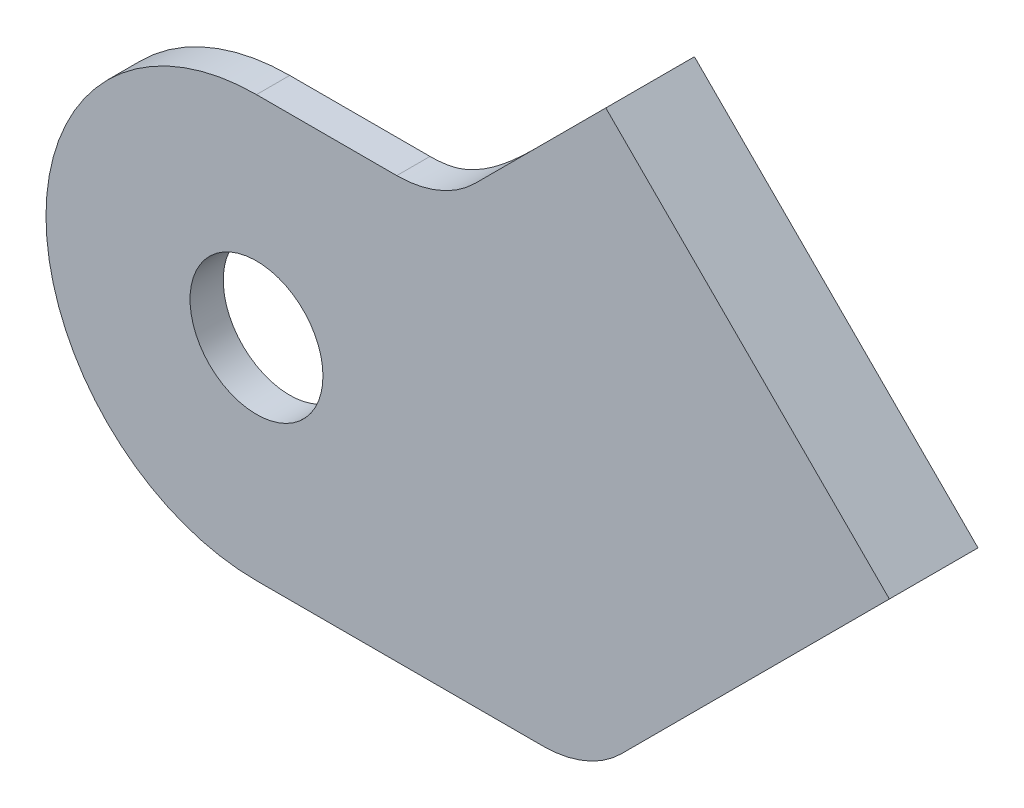
ISO-10303-21;
HEADER;
FILE_DESCRIPTION(('STEP AP214'),'2;1');
FILE_NAME('part.step','',(''),(''),'','','');
FILE_SCHEMA(('AUTOMOTIVE_DESIGN { 1 0 10303 214 1 1 1 1 }'));
ENDSEC;
DATA;
#1=APPLICATION_CONTEXT('core data for automotive mechanical design processes');
#2=APPLICATION_PROTOCOL_DEFINITION('international standard','automotive_design',2000,#1);
#3=PRODUCT_CONTEXT('',#1,'mechanical');
#4=PRODUCT('Part','Part','',(#3));
#5=PRODUCT_RELATED_PRODUCT_CATEGORY('part','',(#4));
#6=PRODUCT_DEFINITION_FORMATION('','',#4);
#7=PRODUCT_DEFINITION_CONTEXT('part definition',#1,'design');
#8=PRODUCT_DEFINITION('design','',#6,#7);
#9=PRODUCT_DEFINITION_SHAPE('','',#8);
#10=(LENGTH_UNIT() NAMED_UNIT(*) SI_UNIT(.MILLI.,.METRE.));
#11=(NAMED_UNIT(*) PLANE_ANGLE_UNIT() SI_UNIT($,.RADIAN.));
#12=(NAMED_UNIT(*) SI_UNIT($,.STERADIAN.) SOLID_ANGLE_UNIT());
#13=UNCERTAINTY_MEASURE_WITH_UNIT(LENGTH_MEASURE(1.E-05),#10,'distance_accuracy_value','');
#14=(GEOMETRIC_REPRESENTATION_CONTEXT(3) GLOBAL_UNCERTAINTY_ASSIGNED_CONTEXT((#13)) GLOBAL_UNIT_ASSIGNED_CONTEXT((#10,
#11,#12)) REPRESENTATION_CONTEXT('',''));
#15=CARTESIAN_POINT('',(0.,0.,0.));
#16=DIRECTION('',(0.,0.,1.));
#17=DIRECTION('',(1.,0.,0.));
#18=AXIS2_PLACEMENT_3D('',#15,#16,#17);
#19=CARTESIAN_POINT('',(0.,0.,0.));
#20=DIRECTION('',(0.,0.,1.));
#21=DIRECTION('',(1.,0.,0.));
#22=AXIS2_PLACEMENT_3D('',#19,#20,#21);
#23=PLANE('',#22);
#24=CARTESIAN_POINT('',(0.,0.,0.));
#25=DIRECTION('',(0.,0.,1.));
#26=DIRECTION('',(1.,0.,0.));
#27=AXIS2_PLACEMENT_3D('',#24,#25,#26);
#28=CIRCLE('',#27,6.);
#29=CARTESIAN_POINT('',(6.,0.,0.));
#30=VERTEX_POINT('',#29);
#31=EDGE_CURVE('E139',#30,#30,#28,.T.);
#32=ORIENTED_EDGE('',*,*,#31,.T.);
#33=EDGE_LOOP('',(#32));
#34=FACE_BOUND('',#33,.T.);
#35=CARTESIAN_POINT('',(12.663333418362,29.,0.));
#36=DIRECTION('',(0.,0.,1.));
#37=DIRECTION('',(1.,0.,0.));
#38=AXIS2_PLACEMENT_3D('',#35,#36,#37);
#39=CIRCLE('',#38,10.);
#40=CARTESIAN_POINT('',(12.663333418362,19.,0.));
#41=VERTEX_POINT('',#40);
#42=CARTESIAN_POINT('',(14.4062480565193,19.1530589234983,0.));
#43=VERTEX_POINT('',#42);
#44=EDGE_CURVE('E239',#41,#43,#39,.T.);
#45=ORIENTED_EDGE('',*,*,#44,.T.);
#46=DIRECTION('',(0.707106781186547,-0.707106781186548,0.));
#47=VECTOR('',#46,1.);
#48=CARTESIAN_POINT('',(16.7796534900088,16.7796534900088,0.));
#49=LINE('',#48,#47);
#50=CARTESIAN_POINT('',(41.279653490009,-7.72034650999148,0.));
#51=VERTEX_POINT('',#50);
#52=EDGE_CURVE('E179',#43,#51,#49,.T.);
#53=ORIENTED_EDGE('',*,*,#52,.T.);
#54=DIRECTION('',(0.707106781186534,0.707106781186562,0.));
#55=VECTOR('',#54,1.);
#56=CARTESIAN_POINT('',(30.0000000000005,-19.0000000000005,0.));
#57=LINE('',#56,#55);
#58=CARTESIAN_POINT('',(32.9289321881351,-16.0710678118657,0.));
#59=VERTEX_POINT('',#58);
#60=EDGE_CURVE('E118',#59,#51,#57,.T.);
#61=ORIENTED_EDGE('',*,*,#60,.F.);
#62=CARTESIAN_POINT('',(25.8578643762695,-9.00000000000041,0.));
#63=DIRECTION('',(0.,0.,1.));
#64=DIRECTION('',(1.,0.,0.));
#65=AXIS2_PLACEMENT_3D('',#62,#63,#64);
#66=CIRCLE('',#65,10.);
#67=CARTESIAN_POINT('',(25.8578643762693,-19.0000000000004,0.));
#68=VERTEX_POINT('',#67);
#69=EDGE_CURVE('E236',#59,#68,#66,.F.);
#70=ORIENTED_EDGE('',*,*,#69,.T.);
#71=DIRECTION('',(1.,0.,0.));
#72=VECTOR('',#71,1.);
#73=CARTESIAN_POINT('',(0.,-19.,0.));
#74=LINE('',#73,#72);
#75=CARTESIAN_POINT('',(0.,-19.,0.));
#76=VERTEX_POINT('',#75);
#77=EDGE_CURVE('E168',#76,#68,#74,.T.);
#78=ORIENTED_EDGE('',*,*,#77,.F.);
#79=CARTESIAN_POINT('',(0.,0.,0.));
#80=DIRECTION('',(0.,0.,1.));
#81=DIRECTION('',(1.,0.,0.));
#82=AXIS2_PLACEMENT_3D('',#79,#80,#81);
#83=CIRCLE('',#82,19.);
#84=CARTESIAN_POINT('',(0.,19.,0.));
#85=VERTEX_POINT('',#84);
#86=EDGE_CURVE('E149',#85,#76,#83,.T.);
#87=ORIENTED_EDGE('',*,*,#86,.F.);
#88=DIRECTION('',(-1.,0.,0.));
#89=VECTOR('',#88,1.);
#90=CARTESIAN_POINT('',(16.8054690420928,19.,0.));
#91=LINE('',#90,#89);
#92=EDGE_CURVE('E155',#41,#85,#91,.T.);
#93=ORIENTED_EDGE('',*,*,#92,.F.);
#94=EDGE_LOOP('',(#45,#53,#61,#70,#78,#87,#93));
#95=FACE_BOUND('',#94,.T.);
#96=ADVANCED_FACE('F35',(#34,#95),#23,.F.);
#97=CARTESIAN_POINT('',(0.,0.,3.));
#98=DIRECTION('',(0.,0.,1.));
#99=DIRECTION('',(1.,0.,0.));
#100=AXIS2_PLACEMENT_3D('',#97,#98,#99);
#101=PLANE('',#100);
#102=CARTESIAN_POINT('',(0.,0.,3.));
#103=DIRECTION('',(0.,0.,1.));
#104=DIRECTION('',(1.,0.,0.));
#105=AXIS2_PLACEMENT_3D('',#102,#103,#104);
#106=CIRCLE('',#105,6.);
#107=CARTESIAN_POINT('',(6.,0.,3.));
#108=VERTEX_POINT('',#107);
#109=EDGE_CURVE('E138',#108,#108,#106,.T.);
#110=ORIENTED_EDGE('',*,*,#109,.F.);
#111=EDGE_LOOP('',(#110));
#112=FACE_BOUND('',#111,.T.);
#113=DIRECTION('',(0.707106781186548,-0.707106781186547,0.));
#114=VECTOR('',#113,1.);
#115=CARTESIAN_POINT('',(31.5330339697045,33.727564927611,3.));
#116=LINE('',#115,#114);
#117=CARTESIAN_POINT('',(31.5330339697045,33.727564927611,3.));
#118=VERTEX_POINT('',#117);
#119=CARTESIAN_POINT('',(57.1302994486582,8.13029944865731,3.));
#120=VERTEX_POINT('',#119);
#121=EDGE_CURVE('E142',#118,#120,#116,.T.);
#122=ORIENTED_EDGE('',*,*,#121,.F.);
#123=DIRECTION('',(-0.707106781186559,-0.707106781186536,0.));
#124=VECTOR('',#123,1.);
#125=CARTESIAN_POINT('',(38.60410178157,40.7986327394764,3.));
#126=LINE('',#125,#124);
#127=CARTESIAN_POINT('',(19.7344012302274,21.9289321881344,3.));
#128=VERTEX_POINT('',#127);
#129=EDGE_CURVE('E161',#118,#128,#126,.T.);
#130=ORIENTED_EDGE('',*,*,#129,.T.);
#131=CARTESIAN_POINT('',(12.663333418362,29.,3.));
#132=DIRECTION('',(0.,0.,1.));
#133=DIRECTION('',(1.,0.,0.));
#134=AXIS2_PLACEMENT_3D('',#131,#132,#133);
#135=CIRCLE('',#134,10.);
#136=CARTESIAN_POINT('',(12.663333418362,19.,3.));
#137=VERTEX_POINT('',#136);
#138=EDGE_CURVE('E177',#128,#137,#135,.F.);
#139=ORIENTED_EDGE('',*,*,#138,.T.);
#140=DIRECTION('',(-1.,0.,0.));
#141=VECTOR('',#140,1.);
#142=CARTESIAN_POINT('',(16.8054690420928,19.,3.));
#143=LINE('',#142,#141);
#144=CARTESIAN_POINT('',(0.,19.,3.));
#145=VERTEX_POINT('',#144);
#146=EDGE_CURVE('E163',#137,#145,#143,.T.);
#147=ORIENTED_EDGE('',*,*,#146,.T.);
#148=CARTESIAN_POINT('',(0.,0.,3.));
#149=DIRECTION('',(0.,0.,1.));
#150=DIRECTION('',(1.,0.,0.));
#151=AXIS2_PLACEMENT_3D('',#148,#149,#150);
#152=CIRCLE('',#151,19.);
#153=CARTESIAN_POINT('',(0.,-19.,3.));
#154=VERTEX_POINT('',#153);
#155=EDGE_CURVE('E151',#145,#154,#152,.T.);
#156=ORIENTED_EDGE('',*,*,#155,.T.);
#157=DIRECTION('',(1.,0.,0.));
#158=VECTOR('',#157,1.);
#159=CARTESIAN_POINT('',(0.,-19.,3.));
#160=LINE('',#159,#158);
#161=CARTESIAN_POINT('',(25.8578643762693,-19.0000000000004,3.));
#162=VERTEX_POINT('',#161);
#163=EDGE_CURVE('E154',#154,#162,#160,.T.);
#164=ORIENTED_EDGE('',*,*,#163,.T.);
#165=CARTESIAN_POINT('',(25.8578643762695,-9.00000000000041,3.));
#166=DIRECTION('',(0.,0.,1.));
#167=DIRECTION('',(1.,0.,0.));
#168=AXIS2_PLACEMENT_3D('',#165,#166,#167);
#169=CIRCLE('',#168,10.);
#170=CARTESIAN_POINT('',(32.9289321881351,-16.0710678118657,3.));
#171=VERTEX_POINT('',#170);
#172=EDGE_CURVE('E237',#162,#171,#169,.T.);
#173=ORIENTED_EDGE('',*,*,#172,.T.);
#174=DIRECTION('',(0.707106781186534,0.707106781186562,0.));
#175=VECTOR('',#174,1.);
#176=CARTESIAN_POINT('',(30.0000000000005,-19.0000000000005,3.));
#177=LINE('',#176,#175);
#178=EDGE_CURVE('E158',#171,#120,#177,.T.);
#179=ORIENTED_EDGE('',*,*,#178,.T.);
#180=EDGE_LOOP('',(#122,#130,#139,#147,#156,#164,#173,#179));
#181=FACE_BOUND('',#180,.T.);
#182=ADVANCED_FACE('F204',(#112,#181),#101,.T.);
#183=CARTESIAN_POINT('',(0.,0.,3.));
#184=DIRECTION('',(0.,0.,-1.));
#185=DIRECTION('',(-1.,0.,0.));
#186=AXIS2_PLACEMENT_3D('',#183,#184,#185);
#187=CYLINDRICAL_SURFACE('',#186,19.);
#188=ORIENTED_EDGE('',*,*,#86,.T.);
#189=DIRECTION('',(0.,0.,-1.));
#190=VECTOR('',#189,1.);
#191=CARTESIAN_POINT('',(0.,-19.,3.));
#192=LINE('',#191,#190);
#193=EDGE_CURVE('E233',#154,#76,#192,.T.);
#194=ORIENTED_EDGE('',*,*,#193,.F.);
#195=ORIENTED_EDGE('',*,*,#155,.F.);
#196=DIRECTION('',(0.,0.,-1.));
#197=VECTOR('',#196,1.);
#198=CARTESIAN_POINT('',(0.,19.,3.));
#199=LINE('',#198,#197);
#200=EDGE_CURVE('E165',#145,#85,#199,.T.);
#201=ORIENTED_EDGE('',*,*,#200,.T.);
#202=EDGE_LOOP('',(#188,#194,#195,#201));
#203=FACE_BOUND('',#202,.T.);
#204=ADVANCED_FACE('F191',(#203),#187,.T.);
#205=CARTESIAN_POINT('',(0.,-19.,3.));
#206=DIRECTION('',(0.,1.,0.));
#207=DIRECTION('',(-1.,0.,0.));
#208=AXIS2_PLACEMENT_3D('',#205,#206,#207);
#209=PLANE('',#208);
#210=ORIENTED_EDGE('',*,*,#77,.T.);
#211=DIRECTION('',(0.,0.,-1.));
#212=VECTOR('',#211,1.);
#213=CARTESIAN_POINT('',(25.8578643762693,-19.0000000000004,3.));
#214=LINE('',#213,#212);
#215=EDGE_CURVE('E231',#68,#162,#214,.F.);
#216=ORIENTED_EDGE('',*,*,#215,.T.);
#217=ORIENTED_EDGE('',*,*,#163,.F.);
#218=ORIENTED_EDGE('',*,*,#193,.T.);
#219=EDGE_LOOP('',(#210,#216,#217,#218));
#220=FACE_BOUND('',#219,.T.);
#221=ADVANCED_FACE('F222',(#220),#209,.F.);
#222=CARTESIAN_POINT('',(30.0000000000005,-19.0000000000005,3.));
#223=DIRECTION('',(-0.707106781186561,0.707106781186533,0.));
#224=DIRECTION('',(-0.707106781186534,-0.707106781186562,0.));
#225=AXIS2_PLACEMENT_3D('',#222,#223,#224);
#226=PLANE('',#225);
#227=ORIENTED_EDGE('',*,*,#60,.T.);
#228=CARTESIAN_POINT('',(41.279653490009,-7.72034650999149,-8.));
#229=DIRECTION('',(-0.707106781186561,0.707106781186533,0.));
#230=DIRECTION('',(-0.707106781186534,-0.707106781186562,0.));
#231=AXIS2_PLACEMENT_3D('',#228,#229,#230);
#232=CIRCLE('',#231,8.);
#233=CARTESIAN_POINT('',(46.52369773086,-2.47630226914089,-5.));
#234=VERTEX_POINT('',#233);
#235=EDGE_CURVE('E11',#51,#234,#232,.T.);
#236=ORIENTED_EDGE('',*,*,#235,.T.);
#237=DIRECTION('',(-0.707106781186548,-0.707106781186547,0.));
#238=VECTOR('',#237,1.);
#239=CARTESIAN_POINT('',(46.52369773086,-2.47630226914089,-5.));
#240=LINE('',#239,#238);
#241=CARTESIAN_POINT('',(57.1302994486582,8.13029944865731,-5.));
#242=VERTEX_POINT('',#241);
#243=EDGE_CURVE('E115',#242,#234,#240,.T.);
#244=ORIENTED_EDGE('',*,*,#243,.F.);
#245=DIRECTION('',(0.,0.,1.));
#246=VECTOR('',#245,1.);
#247=CARTESIAN_POINT('',(57.1302994486582,8.13029944865731,0.));
#248=LINE('',#247,#246);
#249=EDGE_CURVE('E147',#242,#120,#248,.T.);
#250=ORIENTED_EDGE('',*,*,#249,.T.);
#251=ORIENTED_EDGE('',*,*,#178,.F.);
#252=DIRECTION('',(0.,0.,-1.));
#253=VECTOR('',#252,1.);
#254=CARTESIAN_POINT('',(32.9289321881351,-16.0710678118657,3.));
#255=LINE('',#254,#253);
#256=EDGE_CURVE('E241',#171,#59,#255,.T.);
#257=ORIENTED_EDGE('',*,*,#256,.T.);
#258=EDGE_LOOP('',(#227,#236,#244,#250,#251,#257));
#259=FACE_BOUND('',#258,.T.);
#260=ADVANCED_FACE('F113',(#259),#226,.F.);
#261=CARTESIAN_POINT('',(38.60410178157,40.7986327394764,3.));
#262=DIRECTION('',(0.707106781186536,-0.707106781186559,0.));
#263=DIRECTION('',(0.707106781186559,0.707106781186536,0.));
#264=AXIS2_PLACEMENT_3D('',#261,#262,#263);
#265=PLANE('',#264);
#266=ORIENTED_EDGE('',*,*,#129,.F.);
#267=DIRECTION('',(0.,0.,1.));
#268=VECTOR('',#267,1.);
#269=CARTESIAN_POINT('',(31.5330339697045,33.727564927611,0.));
#270=LINE('',#269,#268);
#271=CARTESIAN_POINT('',(31.5330339697045,33.7275649276112,-5.));
#272=VERTEX_POINT('',#271);
#273=EDGE_CURVE('E146',#272,#118,#270,.T.);
#274=ORIENTED_EDGE('',*,*,#273,.F.);
#275=DIRECTION('',(0.707106781186548,0.707106781186547,0.));
#276=VECTOR('',#275,1.);
#277=CARTESIAN_POINT('',(31.5330339697045,33.7275649276112,-5.));
#278=LINE('',#277,#276);
#279=CARTESIAN_POINT('',(20.9264322519062,23.1209632098129,-5.));
#280=VERTEX_POINT('',#279);
#281=EDGE_CURVE('E133',#280,#272,#278,.T.);
#282=ORIENTED_EDGE('',*,*,#281,.F.);
#283=CARTESIAN_POINT('',(15.6823880110552,17.8769189689624,-8.));
#284=DIRECTION('',(0.707106781186536,-0.707106781186559,0.));
#285=DIRECTION('',(0.707106781186559,0.707106781186536,0.));
#286=AXIS2_PLACEMENT_3D('',#283,#284,#285);
#287=CIRCLE('',#286,8.);
#288=CARTESIAN_POINT('',(19.7344012302274,21.9289321881344,-2.41767273054429));
#289=VERTEX_POINT('',#288);
#290=EDGE_CURVE('E132',#280,#289,#287,.T.);
#291=ORIENTED_EDGE('',*,*,#290,.T.);
#292=DIRECTION('',(0.,0.,-1.));
#293=VECTOR('',#292,1.);
#294=CARTESIAN_POINT('',(19.7344012302274,21.9289321881344,3.));
#295=LINE('',#294,#293);
#296=EDGE_CURVE('E51',#289,#128,#295,.F.);
#297=ORIENTED_EDGE('',*,*,#296,.T.);
#298=EDGE_LOOP('',(#266,#274,#282,#291,#297));
#299=FACE_BOUND('',#298,.T.);
#300=ADVANCED_FACE('F216',(#299),#265,.F.);
#301=CARTESIAN_POINT('',(16.8054690420928,19.,3.));
#302=DIRECTION('',(0.,-1.,0.));
#303=DIRECTION('',(0.,0.,-1.));
#304=AXIS2_PLACEMENT_3D('',#301,#302,#303);
#305=PLANE('',#304);
#306=ORIENTED_EDGE('',*,*,#146,.F.);
#307=DIRECTION('',(0.,0.,-1.));
#308=VECTOR('',#307,1.);
#309=CARTESIAN_POINT('',(12.663333418362,19.,0.));
#310=LINE('',#309,#308);
#311=EDGE_CURVE('E252',#137,#41,#310,.T.);
#312=ORIENTED_EDGE('',*,*,#311,.T.);
#313=ORIENTED_EDGE('',*,*,#92,.T.);
#314=ORIENTED_EDGE('',*,*,#200,.F.);
#315=EDGE_LOOP('',(#306,#312,#313,#314));
#316=FACE_BOUND('',#315,.T.);
#317=ADVANCED_FACE('F190',(#316),#305,.F.);
#318=CARTESIAN_POINT('',(12.663333418362,29.,3.));
#319=DIRECTION('',(0.,0.,1.));
#320=DIRECTION('',(1.,0.,0.));
#321=AXIS2_PLACEMENT_3D('',#318,#319,#320);
#322=CYLINDRICAL_SURFACE('',#321,10.);
#323=ORIENTED_EDGE('',*,*,#138,.F.);
#324=ORIENTED_EDGE('',*,*,#296,.F.);
#325=CARTESIAN_POINT('',(19.7344012302274,21.9289321881344,-2.41767273054429));
#326=CARTESIAN_POINT('',(19.6394430360528,21.8339604543938,-2.27976942504431));
#327=CARTESIAN_POINT('',(19.5389930796639,21.7373497408127,-2.14672524031265));
#328=CARTESIAN_POINT('',(19.3269735800482,21.5423459056707,-1.89108813281541));
#329=CARTESIAN_POINT('',(19.215398720912,21.4439519505602,-1.76850025889381));
#330=CARTESIAN_POINT('',(18.9813394021876,21.2471857410923,-1.53489728004715));
#331=CARTESIAN_POINT('',(18.8588792192075,21.1488139057288,-1.4238575644959));
#332=CARTESIAN_POINT('',(18.6030403570762,20.9535246007695,-1.21377096968635));
#333=CARTESIAN_POINT('',(18.4696637795281,20.8566068554666,-1.11472179109307));
#334=CARTESIAN_POINT('',(18.1917618648528,20.6654307923312,-0.928754453611376));
#335=CARTESIAN_POINT('',(18.0471895199557,20.5711862412407,-0.841892287490282));
#336=CARTESIAN_POINT('',(17.7480908251937,20.3874484610219,-0.681212794126067));
#337=CARTESIAN_POINT('',(17.593563669514,20.2979556176036,-0.607396524727747));
#338=CARTESIAN_POINT('',(17.2755333954475,20.125297660059,-0.472984955539221));
#339=CARTESIAN_POINT('',(17.1120320464838,20.0421313062122,-0.412387061145949));
#340=CARTESIAN_POINT('',(16.7771827104988,19.8835008454939,-0.304281098262631));
#341=CARTESIAN_POINT('',(16.6058356814752,19.808035801867,-0.25677143657683));
#342=CARTESIAN_POINT('',(16.2709575060585,19.6718175669398,-0.177827142791639));
#343=CARTESIAN_POINT('',(16.1079447017746,19.610364624023,-0.1453909253802));
#344=CARTESIAN_POINT('',(15.7773876729656,19.4956176359002,-0.0906915809483334));
#345=CARTESIAN_POINT('',(15.6098429511951,19.4423244903008,-0.0684295750846571));
#346=CARTESIAN_POINT('',(15.2709921508503,19.3443672345338,-0.0334094735367085));
#347=CARTESIAN_POINT('',(15.099680350642,19.2997174292915,-0.0206670349863977));
#348=CARTESIAN_POINT('',(14.7545912167475,19.2195024194251,-0.00395687301614609));
#349=CARTESIAN_POINT('',(14.5808149575926,19.1839333766841,1.45630445501339E-05));
#350=CARTESIAN_POINT('',(14.4062480565193,19.1530589234983,0.));
#351=B_SPLINE_CURVE_WITH_KNOTS('',3,(#325,#326,#327,#328,#329,#330,#331,#332,#333,#334,#335,
#336,#337,#338,#339,#340,#341,#342,#343,#344,#345,#346,#347,#348,#349,#350),.UNSPECIFIED.,.F.,
.F.,(4,2,2,2,2,2,2,2,2,2,2,2,4),(0.,0.577393751605974,1.15506473871265,1.73147825683985,
2.3077810648016,2.8866505596847,3.46556697149727,4.04436964673974,4.62310183470867,
5.15417581524371,5.68530830386999,6.21731245125605,6.74909136564925),.UNSPECIFIED.);
#352=EDGE_CURVE('E44',#289,#43,#351,.T.);
#353=ORIENTED_EDGE('',*,*,#352,.T.);
#354=ORIENTED_EDGE('',*,*,#44,.F.);
#355=ORIENTED_EDGE('',*,*,#311,.F.);
#356=EDGE_LOOP('',(#323,#324,#353,#354,#355));
#357=FACE_BOUND('',#356,.T.);
#358=ADVANCED_FACE('F185',(#357),#322,.F.);
#359=CARTESIAN_POINT('',(25.8578643762695,-9.00000000000041,3.));
#360=DIRECTION('',(0.,0.,-1.));
#361=DIRECTION('',(-1.,0.,0.));
#362=AXIS2_PLACEMENT_3D('',#359,#360,#361);
#363=CYLINDRICAL_SURFACE('',#362,10.);
#364=ORIENTED_EDGE('',*,*,#172,.F.);
#365=ORIENTED_EDGE('',*,*,#215,.F.);
#366=ORIENTED_EDGE('',*,*,#69,.F.);
#367=ORIENTED_EDGE('',*,*,#256,.F.);
#368=EDGE_LOOP('',(#364,#365,#366,#367));
#369=FACE_BOUND('',#368,.T.);
#370=ADVANCED_FACE('F189',(#369),#363,.T.);
#371=CARTESIAN_POINT('',(31.5330339697045,33.727564927611,0.));
#372=DIRECTION('',(-0.707106781186547,-0.707106781186548,0.));
#373=DIRECTION('',(0.707106781186548,-0.707106781186547,0.));
#374=AXIS2_PLACEMENT_3D('',#371,#372,#373);
#375=PLANE('',#374);
#376=ORIENTED_EDGE('',*,*,#121,.T.);
#377=ORIENTED_EDGE('',*,*,#249,.F.);
#378=DIRECTION('',(0.707106781186544,-0.70710678118655,0.));
#379=VECTOR('',#378,1.);
#380=CARTESIAN_POINT('',(57.1302994486582,8.13029944865731,-5.));
#381=LINE('',#380,#379);
#382=EDGE_CURVE('E130',#272,#242,#381,.T.);
#383=ORIENTED_EDGE('',*,*,#382,.F.);
#384=ORIENTED_EDGE('',*,*,#273,.T.);
#385=EDGE_LOOP('',(#376,#377,#383,#384));
#386=FACE_BOUND('',#385,.T.);
#387=ADVANCED_FACE('F194',(#386),#375,.F.);
#388=CARTESIAN_POINT('',(0.,0.,0.));
#389=DIRECTION('',(0.,0.,1.));
#390=DIRECTION('',(1.,0.,0.));
#391=AXIS2_PLACEMENT_3D('',#388,#389,#390);
#392=CYLINDRICAL_SURFACE('',#391,6.);
#393=ORIENTED_EDGE('',*,*,#31,.F.);
#394=EDGE_LOOP('',(#393));
#395=FACE_BOUND('',#394,.T.);
#396=ORIENTED_EDGE('',*,*,#109,.T.);
#397=EDGE_LOOP('',(#396));
#398=FACE_BOUND('',#397,.T.);
#399=ADVANCED_FACE('F199',(#395,#398),#392,.F.);
#400=CARTESIAN_POINT('',(0.,0.,-5.));
#401=DIRECTION('',(0.,0.,1.));
#402=DIRECTION('',(1.,0.,0.));
#403=AXIS2_PLACEMENT_3D('',#400,#401,#402);
#404=PLANE('',#403);
#405=ORIENTED_EDGE('',*,*,#243,.T.);
#406=DIRECTION('',(-0.707106781186547,0.707106781186547,0.));
#407=VECTOR('',#406,1.);
#408=CARTESIAN_POINT('',(20.9264322519062,23.1209632098129,-5.));
#409=LINE('',#408,#407);
#410=EDGE_CURVE('E127',#234,#280,#409,.T.);
#411=ORIENTED_EDGE('',*,*,#410,.T.);
#412=ORIENTED_EDGE('',*,*,#281,.T.);
#413=ORIENTED_EDGE('',*,*,#382,.T.);
#414=EDGE_LOOP('',(#405,#411,#412,#413));
#415=FACE_BOUND('',#414,.T.);
#416=ADVANCED_FACE('F125',(#415),#404,.F.);
#417=CARTESIAN_POINT('',(15.6823880110554,17.8769189689621,-8.));
#418=DIRECTION('',(0.707106781186547,-0.707106781186548,0.));
#419=DIRECTION('',(0.707106781186548,0.707106781186547,0.));
#420=AXIS2_PLACEMENT_3D('',#417,#418,#419);
#421=CYLINDRICAL_SURFACE('',#420,8.);
#422=ORIENTED_EDGE('',*,*,#235,.F.);
#423=ORIENTED_EDGE('',*,*,#52,.F.);
#424=ORIENTED_EDGE('',*,*,#352,.F.);
#425=ORIENTED_EDGE('',*,*,#290,.F.);
#426=ORIENTED_EDGE('',*,*,#410,.F.);
#427=EDGE_LOOP('',(#422,#423,#424,#425,#426));
#428=FACE_BOUND('',#427,.T.);
#429=ADVANCED_FACE('F37',(#428),#421,.F.);
#430=CLOSED_SHELL('',(#96,#182,#204,#221,#260,#300,#317,#358,#370,#387,#399,#416,#429));
#431=MANIFOLD_SOLID_BREP('B2',#430);
#432=ADVANCED_BREP_SHAPE_REPRESENTATION('',(#18,#431),#14);
#433=SHAPE_DEFINITION_REPRESENTATION(#9,#432);
ENDSEC;
END-ISO-10303-21;
